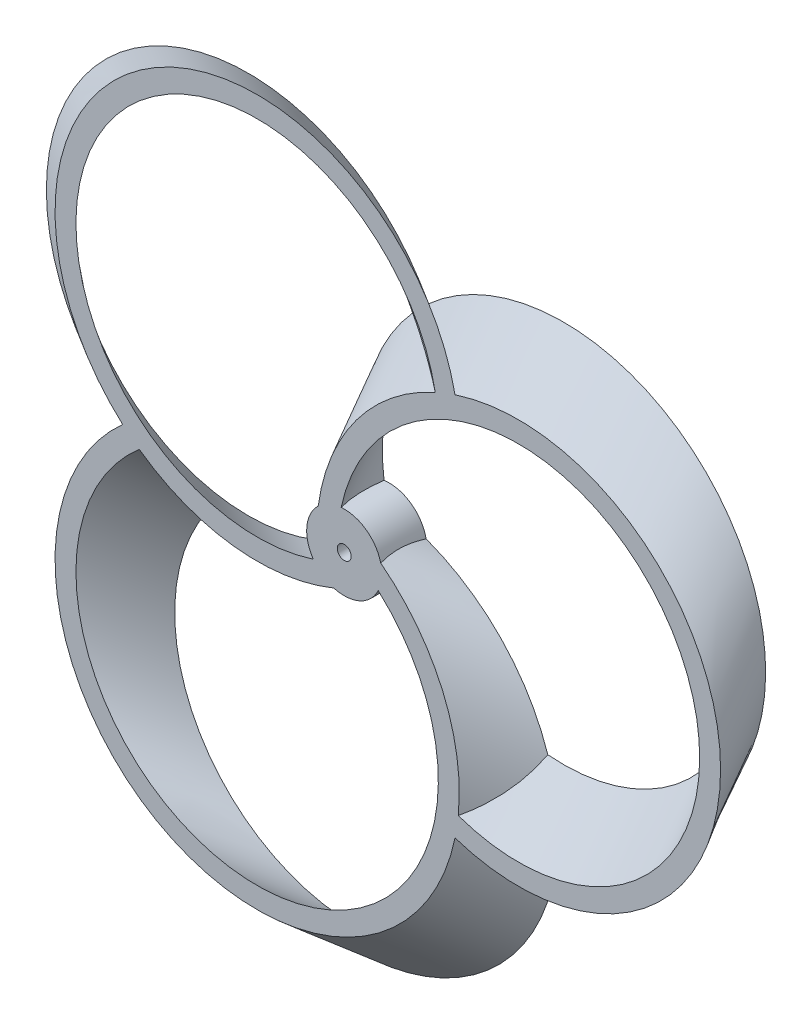
ISO-10303-21;
HEADER;
FILE_DESCRIPTION(('STEP AP214'),'2;1');
FILE_NAME('part.step','',(''),(''),'','','');
FILE_SCHEMA(('AUTOMOTIVE_DESIGN { 1 0 10303 214 1 1 1 1 }'));
ENDSEC;
DATA;
#1=APPLICATION_CONTEXT('core data for automotive mechanical design processes');
#2=APPLICATION_PROTOCOL_DEFINITION('international standard','automotive_design',2000,#1);
#3=PRODUCT_CONTEXT('',#1,'mechanical');
#4=PRODUCT('Part','Part','',(#3));
#5=PRODUCT_RELATED_PRODUCT_CATEGORY('part','',(#4));
#6=PRODUCT_DEFINITION_FORMATION('','',#4);
#7=PRODUCT_DEFINITION_CONTEXT('part definition',#1,'design');
#8=PRODUCT_DEFINITION('design','',#6,#7);
#9=PRODUCT_DEFINITION_SHAPE('','',#8);
#10=(LENGTH_UNIT() NAMED_UNIT(*) SI_UNIT(.MILLI.,.METRE.));
#11=(NAMED_UNIT(*) PLANE_ANGLE_UNIT() SI_UNIT($,.RADIAN.));
#12=(NAMED_UNIT(*) SI_UNIT($,.STERADIAN.) SOLID_ANGLE_UNIT());
#13=UNCERTAINTY_MEASURE_WITH_UNIT(LENGTH_MEASURE(1.E-05),#10,'distance_accuracy_value','');
#14=(GEOMETRIC_REPRESENTATION_CONTEXT(3) GLOBAL_UNCERTAINTY_ASSIGNED_CONTEXT((#13)) GLOBAL_UNIT_ASSIGNED_CONTEXT((#10,
#11,#12)) REPRESENTATION_CONTEXT('',''));
#15=CARTESIAN_POINT('',(0.,0.,0.));
#16=DIRECTION('',(0.,0.,1.));
#17=DIRECTION('',(1.,0.,0.));
#18=AXIS2_PLACEMENT_3D('',#15,#16,#17);
#19=CARTESIAN_POINT('',(0.,4.44959346906221,-3.23281888760861));
#20=DIRECTION('',(0.,0.,1.));
#21=DIRECTION('',(1.,0.,0.));
#22=AXIS2_PLACEMENT_3D('',#19,#20,#21);
#23=CIRCLE('',#22,13.);
#24=DIRECTION('',(0.,-0.809016994374947,0.587785252292474));
#25=VECTOR('',#24,1.);
#26=SURFACE_OF_LINEAR_EXTRUSION('',#23,#25);
#27=CARTESIAN_POINT('',(0.,0.,0.));
#28=DIRECTION('',(0.,0.,1.));
#29=DIRECTION('',(1.,0.,0.));
#30=AXIS2_PLACEMENT_3D('',#27,#28,#29);
#31=CIRCLE('',#30,13.);
#32=CARTESIAN_POINT('',(-4.32122949310312,-12.2607901730653,0.));
#33=VERTEX_POINT('',#32);
#34=CARTESIAN_POINT('',(-12.7189837148581,2.68839231905867,0.));
#35=VERTEX_POINT('',#34);
#36=EDGE_CURVE('E60',#33,#35,#31,.T.);
#37=ORIENTED_EDGE('',*,*,#36,.T.);
#38=CARTESIAN_POINT('',(-12.7189837148581,2.68839231905867,0.));
#39=CARTESIAN_POINT('',(-12.7463417927234,2.68615857240916,-0.0923844254176689));
#40=CARTESIAN_POINT('',(-12.7718338753196,2.6836667689847,-0.185319150187502));
#41=CARTESIAN_POINT('',(-12.8189369738117,2.67848003238839,-0.372170355485341));
#42=CARTESIAN_POINT('',(-12.8405476095616,2.67578507935687,-0.466086931222962));
#43=CARTESIAN_POINT('',(-12.8797372619475,2.67050505660484,-0.654783825309206));
#44=CARTESIAN_POINT('',(-12.8973154671817,2.66792000908452,-0.749564313511201));
#45=CARTESIAN_POINT('',(-12.9283501862398,2.66311223085249,-0.939796469361922));
#46=CARTESIAN_POINT('',(-12.9418069031029,2.66088948229516,-1.03524810371053));
#47=CARTESIAN_POINT('',(-12.9754810234457,2.65515803792089,-1.31862116087548));
#48=CARTESIAN_POINT('',(-12.989776671156,2.65246492852231,-1.50729629798837));
#49=CARTESIAN_POINT('',(-13.0025089545335,2.65008141766242,-1.88509885026276));
#50=CARTESIAN_POINT('',(-13.0009531788899,2.65038957937349,-2.07422600567292));
#51=CARTESIAN_POINT('',(-12.9878245433991,2.65281734198664,-2.34394061224457));
#52=CARTESIAN_POINT('',(-12.9824737432342,2.65380304428468,-2.42488601986645));
#53=CARTESIAN_POINT('',(-12.9690101636256,2.65621643668724,-2.58652999720265));
#54=CARTESIAN_POINT('',(-12.9608978873113,2.65764404627382,-2.66722860918161));
#55=CARTESIAN_POINT('',(-12.9418775326857,2.66087314117271,-2.8289914686251));
#56=CARTESIAN_POINT('',(-12.9309459688331,2.6626777417046,-2.91005287604245));
#57=CARTESIAN_POINT('',(-12.9063619642531,2.6665383299205,-3.07176661633674));
#58=CARTESIAN_POINT('',(-12.892709183851,2.66859434897533,-3.15241889685446));
#59=CARTESIAN_POINT('',(-12.8777173239326,2.67071839619004,-3.23281888760861));
#60=B_SPLINE_CURVE_WITH_KNOTS('',3,(#38,#39,#40,#41,#42,#43,#44,#45,#46,#47,#48,#49,#50,#51,#52,
#53,#54,#55,#56,#57,#58,#59),.UNSPECIFIED.,.F.,.F.,(4,2,2,2,2,2,2,2,2,2,4),(0.,
0.289113642145493,0.578255584451217,0.867455656690222,1.15664147960659,1.72360184655008,
2.29029080040493,2.5336378390645,2.77694056462379,3.02233950676622,3.26776909994948),.UNSPECIFIED.);
#61=CARTESIAN_POINT('',(-12.8777173239326,2.67071839619005,-3.23281888760861));
#62=VERTEX_POINT('',#61);
#63=EDGE_CURVE('E146',#35,#62,#60,.T.);
#64=ORIENTED_EDGE('',*,*,#63,.T.);
#65=CARTESIAN_POINT('',(0.,4.44959346906221,-3.23281888760861));
#66=DIRECTION('',(0.,0.,1.));
#67=DIRECTION('',(1.,0.,0.));
#68=AXIS2_PLACEMENT_3D('',#65,#66,#67);
#69=CIRCLE('',#68,13.);
#70=CARTESIAN_POINT('',(-1.12851168990511,-8.50133164715044,-3.23281888760861));
#71=VERTEX_POINT('',#70);
#72=EDGE_CURVE('E336',#71,#62,#69,.T.);
#73=ORIENTED_EDGE('',*,*,#72,.F.);
#74=CARTESIAN_POINT('',(-1.12851168990511,-8.50133164715044,-3.23281888760861));
#75=CARTESIAN_POINT('',(-1.18645766435644,-8.64814617753544,-3.12248080137753));
#76=CARTESIAN_POINT('',(-1.2502988430566,-8.79309059835952,-3.01284916794036));
#77=CARTESIAN_POINT('',(-1.38863222664076,-9.07864108878982,-2.79513133820698));
#78=CARTESIAN_POINT('',(-1.46310920004046,-9.21925301872113,-2.68704317092416));
#79=CARTESIAN_POINT('',(-1.62172037115464,-9.49591595256459,-2.47226542708657));
#80=CARTESIAN_POINT('',(-1.70585155738023,-9.63196836173428,-2.36557542590255));
#81=CARTESIAN_POINT('',(-1.88140983565848,-9.89695099901534,-2.15527844702374));
#82=CARTESIAN_POINT('',(-1.97268786506394,-10.0259631608396,-2.0516499303572));
#83=CARTESIAN_POINT('',(-2.16305305928808,-10.27907142084,-1.84547197766964));
#84=CARTESIAN_POINT('',(-2.26214242611901,-10.4031661178638,-1.74292285523076));
#85=CARTESIAN_POINT('',(-2.46744051634613,-10.6461193864864,-1.53881419645728));
#86=CARTESIAN_POINT('',(-2.57364910448283,-10.7649780574944,-1.43725464136365));
#87=CARTESIAN_POINT('',(-2.9256944925095,-11.1383747988034,-1.11201126192171));
#88=CARTESIAN_POINT('',(-3.18442411758121,-11.3823429845432,-0.889837189466662));
#89=CARTESIAN_POINT('',(-3.5481263079914,-11.6887739345416,-0.594326102541099));
#90=CARTESIAN_POINT('',(-3.64144886969094,-11.7644378617914,-0.519864259704357));
#91=CARTESIAN_POINT('',(-3.83096536276109,-11.9123110447375,-0.371112065703074));
#92=CARTESIAN_POINT('',(-3.92715953912305,-11.9845200042981,-0.296821729756467));
#93=CARTESIAN_POINT('',(-4.12223194822886,-12.1253663210096,-0.148345895362834));
#94=CARTESIAN_POINT('',(-4.2211105112913,-12.1940032355551,-0.0741604110104488));
#95=CARTESIAN_POINT('',(-4.32122949310312,-12.2607901730653,0.));
#96=B_SPLINE_CURVE_WITH_KNOTS('',3,(#74,#75,#76,#77,#78,#79,#80,#81,#82,#83,#84,#85,#86,#87,#88,
#89,#90,#91,#92,#93,#94,#95),.UNSPECIFIED.,.F.,.F.,(4,2,2,2,2,2,2,2,2,2,4),(0.,
0.577554499969389,1.15429002967393,1.73084614181192,2.29756004548099,2.86443428077121,
3.43129774895683,4.68674562692945,5.11075151890951,5.53479368885221,5.95888827658714),.UNSPECIFIED.);
#97=EDGE_CURVE('E292',#71,#33,#96,.T.);
#98=ORIENTED_EDGE('',*,*,#97,.T.);
#99=EDGE_LOOP('',(#37,#64,#73,#98));
#100=FACE_BOUND('',#99,.T.);
#101=ADVANCED_FACE('F43',(#100),#26,.F.);
#102=CARTESIAN_POINT('',(0.,4.44959346906221,-3.23281888760861));
#103=DIRECTION('',(0.,0.,1.));
#104=DIRECTION('',(1.,0.,0.));
#105=AXIS2_PLACEMENT_3D('',#102,#103,#104);
#106=CIRCLE('',#105,14.5);
#107=DIRECTION('',(0.,-0.809016994374947,0.587785252292474));
#108=VECTOR('',#107,1.);
#109=SURFACE_OF_LINEAR_EXTRUSION('',#106,#108);
#110=CARTESIAN_POINT('',(-14.3689837148581,1.94481541595645,0.));
#111=CARTESIAN_POINT('',(-14.3847538150584,1.9296508825989,-0.0735960266043187));
#112=CARTESIAN_POINT('',(-14.3990224233594,1.91557833195695,-0.147742582054409));
#113=CARTESIAN_POINT('',(-14.424611939459,1.88987154416126,-0.296903709137461));
#114=CARTESIAN_POINT('',(-14.435934979277,1.87823554461434,-0.371917611673274));
#115=CARTESIAN_POINT('',(-14.4557084516388,1.85763649842712,-0.522665684282725));
#116=CARTESIAN_POINT('',(-14.4641597239589,1.8486726704715,-0.598399637124876));
#117=CARTESIAN_POINT('',(-14.47819201337,1.83364878587357,-0.749102996324598));
#118=CARTESIAN_POINT('',(-14.4838194810869,1.82754185634638,-0.824063443556932));
#119=CARTESIAN_POINT('',(-14.4925566153714,1.81801182638733,-0.974305483436748));
#120=CARTESIAN_POINT('',(-14.4956660712707,1.81458895051635,-1.04958710242534));
#121=CARTESIAN_POINT('',(-14.4995221530891,1.8103385751389,-1.20027272057413));
#122=CARTESIAN_POINT('',(-14.5002689788354,1.8095108561384,-1.27567670884478));
#123=CARTESIAN_POINT('',(-14.4994229721008,1.81044692236285,-1.45580166263563));
#124=CARTESIAN_POINT('',(-14.4968066434841,1.81334445132072,-1.56051312046061));
#125=CARTESIAN_POINT('',(-14.4877305874762,1.82328744738253,-1.76961079201857));
#126=CARTESIAN_POINT('',(-14.4812688071757,1.83033513004109,-1.87399680206638));
#127=CARTESIAN_POINT('',(-14.4648453495149,1.84795408852355,-2.08227568116927));
#128=CARTESIAN_POINT('',(-14.4548806821437,1.85852837420535,-2.18616805183284));
#129=CARTESIAN_POINT('',(-14.4314432503005,1.88287710508057,-2.39585602025606));
#130=CARTESIAN_POINT('',(-14.4178884827088,1.89672541445419,-2.50163368436388));
#131=CARTESIAN_POINT('',(-14.3876462191943,1.92682452622314,-2.71227919806507));
#132=CARTESIAN_POINT('',(-14.3709618387034,1.94307293600404,-2.81714784486745));
#133=CARTESIAN_POINT('',(-14.3346540800261,1.97739121623045,-3.02575631359646));
#134=CARTESIAN_POINT('',(-14.3150393545125,1.99545567456572,-3.12949852532752));
#135=CARTESIAN_POINT('',(-14.2940117158057,2.0141819908088,-3.23281888760861));
#136=B_SPLINE_CURVE_WITH_KNOTS('',3,(#110,#111,#112,#113,#114,#115,#116,#117,#118,#119,#120,
#121,#122,#123,#124,#125,#126,#127,#128,#129,#130,#131,#132,#133,#134,#135),.UNSPECIFIED.,.F.,
.F.,(4,2,2,2,2,2,2,2,2,2,2,2,4),(0.,0.230318749066538,0.460470325310438,0.690554541461471,
0.916718532286049,1.14290144306306,1.36906522315318,1.68323448620635,1.99757162039073,
2.31217772209166,2.63470426140724,2.95691142331416,3.27818532396254),.UNSPECIFIED.);
#137=CARTESIAN_POINT('',(-14.3689837148581,1.94481541595644,0.));
#138=VERTEX_POINT('',#137);
#139=CARTESIAN_POINT('',(-14.2940117158057,2.01418199080879,-3.23281888760861));
#140=VERTEX_POINT('',#139);
#141=EDGE_CURVE('E134',#138,#140,#136,.T.);
#142=ORIENTED_EDGE('',*,*,#141,.F.);
#143=CARTESIAN_POINT('',(0.,0.,0.));
#144=DIRECTION('',(0.,0.,1.));
#145=DIRECTION('',(1.,0.,0.));
#146=AXIS2_PLACEMENT_3D('',#143,#144,#145);
#147=CIRCLE('',#146,14.5);
#148=CARTESIAN_POINT('',(-5.97122949310328,13.2134181172282,0.));
#149=VERTEX_POINT('',#148);
#150=EDGE_CURVE('E166',#149,#138,#147,.T.);
#151=ORIENTED_EDGE('',*,*,#150,.F.);
#152=CARTESIAN_POINT('',(-10.8233749826185,14.098663578955,-3.23281888760861));
#153=CARTESIAN_POINT('',(-10.6672568824348,14.1218881582256,-3.12248080137753));
#154=CARTESIAN_POINT('',(-10.5098107425142,14.1390722860758,-3.01284916794036));
#155=CARTESIAN_POINT('',(-10.1933500719464,14.1620473069156,-2.79513133820698));
#156=CARTESIAN_POINT('',(-10.0343380818509,14.1678543209201,-2.68704317092417));
#157=CARTESIAN_POINT('',(-9.71543536729986,14.168824484333,-2.47226542708658));
#158=CARTESIAN_POINT('',(-9.55554493160004,14.163990944396,-2.36557542590256));
#159=CARTESIAN_POINT('',(-9.23828409701373,14.1444443342029,-2.15527844702375));
#160=CARTESIAN_POINT('',(-9.080917272774,14.1299013228425,-2.05164993035721));
#161=CARTESIAN_POINT('',(-8.76653649259394,14.0915943586482,-1.84547197766966));
#162=CARTESIAN_POINT('',(-8.60952264908093,14.0678277982396,-1.74292285523078));
#163=CARTESIAN_POINT('',(-8.29646990140777,14.0115110710658,-1.5388141964573));
#164=CARTESIAN_POINT('',(-8.14043097878644,13.9789610711433,-1.43725464136368));
#165=CARTESIAN_POINT('',(-7.64103722110913,13.8607791924816,-1.11201126192173));
#166=CARTESIAN_POINT('',(-7.30038976200746,13.7586968573278,-0.889837189466679));
#167=CARTESIAN_POINT('',(-6.85316167959791,13.5969369960197,-0.59432610254111));
#168=CARTESIAN_POINT('',(-6.74097351559971,13.5539492504666,-0.519864259704367));
#169=CARTESIAN_POINT('',(-6.51815333609484,13.4637597445048,-0.37111206570308));
#170=CARTESIAN_POINT('',(-6.40752145455357,13.4165576238595,-0.29682172975647));
#171=CARTESIAN_POINT('',(-6.18800876169901,13.3180431203522,-0.148345895362833));
#172=CARTESIAN_POINT('',(-6.07912816853404,13.2667302301231,-0.0741604110104469));
#173=CARTESIAN_POINT('',(-5.97122949310327,13.2134181172282,0.));
#174=B_SPLINE_CURVE_WITH_KNOTS('',3,(#152,#153,#154,#155,#156,#157,#158,#159,#160,#161,#162,
#163,#164,#165,#166,#167,#168,#169,#170,#171,#172,#173),.UNSPECIFIED.,.F.,.F.,(4,2,2,2,2,2,2,2,
2,2,4),(0.,0.577554499969378,1.1542900296739,1.73084614181189,2.29756004548094,2.86443428077115,
3.43129774895676,4.6867456269294,5.11075151890947,5.53479368885217,5.95888827658711),.UNSPECIFIED.);
#175=CARTESIAN_POINT('',(-10.8233749826186,14.098663578955,-3.23281888760861));
#176=VERTEX_POINT('',#175);
#177=EDGE_CURVE('E164',#176,#149,#174,.T.);
#178=ORIENTED_EDGE('',*,*,#177,.F.);
#179=EDGE_CURVE('E154',#176,#140,#106,.T.);
#180=ORIENTED_EDGE('',*,*,#179,.T.);
#181=EDGE_LOOP('',(#142,#151,#178,#180));
#182=FACE_BOUND('',#181,.T.);
#183=ADVANCED_FACE('F162',(#182),#109,.T.);
#184=CARTESIAN_POINT('',(-22.6034609807212,8.60052081277433,-3.23281888760861));
#185=DIRECTION('',(0.,0.,1.));
#186=DIRECTION('',(-0.500000000000004,0.866025403784436,0.));
#187=AXIS2_PLACEMENT_3D('',#184,#185,#186);
#188=CIRCLE('',#187,14.5);
#189=DIRECTION('',(0.700629269222034,0.404508497187477,0.587785252292474));
#190=VECTOR('',#189,1.);
#191=SURFACE_OF_LINEAR_EXTRUSION('',#188,#190);
#192=CARTESIAN_POINT('',(-13.2497676984608,-2.59099508430477,0.));
#193=CARTESIAN_POINT('',(-13.2287497772365,-2.59707012501966,-0.0735960266043842));
#194=CARTESIAN_POINT('',(-13.209428286734,-2.60239082696402,-0.147742582054474));
#195=CARTESIAN_POINT('',(-13.1743707974035,-2.61169860407894,-0.296903709137526));
#196=CARTESIAN_POINT('',(-13.1586322062884,-2.61568664443597,-0.371917611673338));
#197=CARTESIAN_POINT('',(-13.1309061728157,-2.62251145072866,-0.522665684282789));
#198=CARTESIAN_POINT('',(-13.1189176339309,-2.62534855327435,-0.598399637124942));
#199=CARTESIAN_POINT('',(-13.0988904235,-2.62998893007867,-0.749102996324665));
#200=CARTESIAN_POINT('',(-13.0907879335319,-2.63180899531688,-0.824063443556999));
#201=CARTESIAN_POINT('',(-13.0781661183463,-2.63461056058403,-0.974305483436814));
#202=CARTESIAN_POINT('',(-13.0736470929383,-2.63559199044931,-1.04958710242541));
#203=CARTESIAN_POINT('',(-13.0680381189767,-2.63680626757434,-1.2002727205742));
#204=CARTESIAN_POINT('',(-13.0669478804219,-2.63703917814263,-1.27567670884485));
#205=CARTESIAN_POINT('',(-13.0681815409192,-2.63677454793091,-1.45580166263569));
#206=CARTESIAN_POINT('',(-13.0719990389133,-2.6359575053631,-1.56051312046067));
#207=CARTESIAN_POINT('',(-13.0851479540965,-2.633068908325,-1.76961079201863));
#208=CARTESIAN_POINT('',(-13.0944823164668,-2.63099668376037,-1.87399680206642));
#209=CARTESIAN_POINT('',(-13.1179525109313,-2.62558303144939,-2.08227568116931));
#210=CARTESIAN_POINT('',(-13.1320924446442,-2.62224051920656,-2.18616805183288));
#211=CARTESIAN_POINT('',(-13.1648977800536,-2.61411747326855,-2.39585602025609));
#212=CARTESIAN_POINT('',(-13.1836681515665,-2.60930285487855,-2.50163368436391));
#213=CARTESIAN_POINT('',(-13.224855878747,-2.59816184229151,-2.71227919806509));
#214=CARTESIAN_POINT('',(-13.2472696046338,-2.59183694983045,-2.81714784486746));
#215=CARTESIAN_POINT('',(-13.2951439864627,-2.57755264857457,-3.02575631359647));
#216=CARTESIAN_POINT('',(-13.3205956290435,-2.56959802715921,-3.12949852532752));
#217=CARTESIAN_POINT('',(-13.3473269139827,-2.56075071597907,-3.23281888760861));
#218=B_SPLINE_CURVE_WITH_KNOTS('',3,(#192,#193,#194,#195,#196,#197,#198,#199,#200,#201,#202,
#203,#204,#205,#206,#207,#208,#209,#210,#211,#212,#213,#214,#215,#216,#217),.UNSPECIFIED.,.F.,
.F.,(4,2,2,2,2,2,2,2,2,2,2,2,4),(0.,0.230318749066539,0.460470325310438,0.690554541461471,
0.91671853228605,1.14290144306306,1.36906522315318,1.68323448620634,1.99757162039071,
2.31217772209163,2.6347042614072,2.9569114233141,3.27818532396247),.UNSPECIFIED.);
#219=CARTESIAN_POINT('',(-13.2497676984608,-2.59099508430477,0.));
#220=VERTEX_POINT('',#219);
#221=CARTESIAN_POINT('',(-13.3473269139827,-2.56075071597907,-3.23281888760861));
#222=VERTEX_POINT('',#221);
#223=EDGE_CURVE('E147',#220,#222,#218,.T.);
#224=ORIENTED_EDGE('',*,*,#223,.F.);
#225=CARTESIAN_POINT('',(-18.75,10.8253175473055,0.));
#226=DIRECTION('',(0.,0.,1.));
#227=DIRECTION('',(-0.500000000000004,0.866025403784436,0.));
#228=AXIS2_PLACEMENT_3D('',#225,#226,#227);
#229=CIRCLE('',#228,14.5);
#230=CARTESIAN_POINT('',(-27.2075410137935,-0.952627944162983,0.));
#231=VERTEX_POINT('',#230);
#232=EDGE_CURVE('E167',#231,#220,#229,.T.);
#233=ORIENTED_EDGE('',*,*,#232,.F.);
#234=CARTESIAN_POINT('',(-27.2075410137935,-0.952627944162982,0.));
#235=CARTESIAN_POINT('',(-27.1974852453511,-1.10781024172505,-0.0958240883057379));
#236=CARTESIAN_POINT('',(-27.1837275633948,-1.26271140105515,-0.19167031526418));
#237=CARTESIAN_POINT('',(-27.1488051648338,-1.57155256864467,-0.383598692563256));
#238=CARTESIAN_POINT('',(-27.1276396422702,-1.72549247046546,-0.479680867444646));
#239=CARTESIAN_POINT('',(-27.0529647914315,-2.18562912716629,-0.768793887481483));
#240=CARTESIAN_POINT('',(-26.9883039156924,-2.4897274792722,-0.962437086172746));
#241=CARTESIAN_POINT('',(-26.8413555498713,-3.04208792041832,-1.32239305891755));
#242=CARTESIAN_POINT('',(-26.7633137327912,-3.29173913703731,-1.48832427503447));
#243=CARTESIAN_POINT('',(-26.5856175276696,-3.78116596917834,-1.82266202992291));
#244=CARTESIAN_POINT('',(-26.4859848437783,-4.02095121648104,-1.99106592569477));
#245=CARTESIAN_POINT('',(-26.2614567281139,-4.49434784275585,-2.33588875131675));
#246=CARTESIAN_POINT('',(-26.1359317119411,-4.72759802360199,-2.5124000489996));
#247=CARTESIAN_POINT('',(-25.929479494772,-5.06437588988879,-2.78014056959159));
#248=CARTESIAN_POINT('',(-25.8575406639586,-5.17457240043318,-2.86998889752848));
#249=CARTESIAN_POINT('',(-25.70748660592,-5.38990993179006,-3.05066780601269));
#250=CARTESIAN_POINT('',(-25.6293693259867,-5.495049253603,-3.14149870428073));
#251=CARTESIAN_POINT('',(-25.5481133274762,-5.59733193180471,-3.23281888760861));
#252=B_SPLINE_CURVE_WITH_KNOTS('',3,(#234,#235,#236,#237,#238,#239,#240,#241,#242,#243,#244,
#245,#246,#247,#248,#249,#250,#251),.UNSPECIFIED.,.F.,.F.,(4,2,2,2,2,2,2,2,4),(0.,
0.547896267708718,1.09585216402203,2.19322259724976,3.12166589121922,4.04918016451897,
5.00268083594295,5.48054042070355,5.95855944034039),.UNSPECIFIED.);
#253=CARTESIAN_POINT('',(-25.5481133274762,-5.59733193180471,-3.23281888760861));
#254=VERTEX_POINT('',#253);
#255=EDGE_CURVE('E267',#231,#254,#252,.T.);
#256=ORIENTED_EDGE('',*,*,#255,.T.);
#257=EDGE_CURVE('E173',#254,#222,#188,.T.);
#258=ORIENTED_EDGE('',*,*,#257,.T.);
#259=EDGE_LOOP('',(#224,#233,#256,#258));
#260=FACE_BOUND('',#259,.T.);
#261=ADVANCED_FACE('F183',(#260),#191,.T.);
#262=CARTESIAN_POINT('',(-14.8965390192787,-13.0501142818366,-3.23281888760861));
#263=DIRECTION('',(0.,0.,1.));
#264=DIRECTION('',(-0.499999999999992,-0.866025403784443,0.));
#265=AXIS2_PLACEMENT_3D('',#262,#263,#264);
#266=CIRCLE('',#265,14.5);
#267=DIRECTION('',(-0.70062926922204,0.404508497187467,0.587785252292474));
#268=VECTOR('',#267,1.);
#269=SURFACE_OF_LINEAR_EXTRUSION('',#266,#268);
#270=CARTESIAN_POINT('',(-9.88124858668107,0.646179668348361,0.));
#271=CARTESIAN_POINT('',(-9.8864964077051,0.667419242420791,-0.0735960266043861));
#272=CARTESIAN_POINT('',(-9.89154928990656,0.686812495007096,-0.147742582054476));
#273=CARTESIAN_POINT('',(-9.90101726313755,0.721827059917702,-0.296903709137529));
#274=CARTESIAN_POINT('',(-9.90543281443458,0.737451099821654,-0.371917611673342));
#275=CARTESIAN_POINT('',(-9.91338537554557,0.764874952301562,-0.522665684282794));
#276=CARTESIAN_POINT('',(-9.91692264211025,0.776675882802877,-0.598399637124945));
#277=CARTESIAN_POINT('',(-9.92291756313002,0.796340144205123,-0.749102996324668));
#278=CARTESIAN_POINT('',(-9.92539258538124,0.804267138970526,-0.824063443557002));
#279=CARTESIAN_POINT('',(-9.92927726628234,0.816598734196726,-0.974305483436818));
#280=CARTESIAN_POINT('',(-9.93068683579094,0.821003039932978,-1.04958710242541));
#281=CARTESIAN_POINT('',(-9.93243972793427,0.826467692435458,-1.2002727205742));
#282=CARTESIAN_POINT('',(-9.93278314074271,0.827528322004244,-1.27567670884485));
#283=CARTESIAN_POINT('',(-9.93239548698002,0.826327625568082,-1.45580166263569));
#284=CARTESIAN_POINT('',(-9.93119431760267,0.822613054042397,-1.56051312046067));
#285=CARTESIAN_POINT('',(-9.92712145842736,0.809781460942482,-1.76961079201863));
#286=CARTESIAN_POINT('',(-9.92424887635749,0.800661553719294,-1.87399680206643));
#287=CARTESIAN_POINT('',(-9.91720213955384,0.777628942925852,-2.08227568116931));
#288=CARTESIAN_POINT('',(-9.91302687321214,0.763712145001233,-2.18616805183288));
#289=CARTESIAN_POINT('',(-9.90365896964585,0.73124036818799,-2.39585602025609));
#290=CARTESIAN_POINT('',(-9.89844336572468,0.712577440424375,-2.50163368436391));
#291=CARTESIAN_POINT('',(-9.88749790205869,0.671337316068395,-2.71227919806509));
#292=CARTESIAN_POINT('',(-9.88176855666277,0.648764013826422,-2.81714784486746));
#293=CARTESIAN_POINT('',(-9.8702019335112,0.600161432344137,-3.02575631359647));
#294=CARTESIAN_POINT('',(-9.86436501644402,0.574142352593513,-3.12949852532752));
#295=CARTESIAN_POINT('',(-9.85866137021161,0.5465687251703,-3.23281888760861));
#296=B_SPLINE_CURVE_WITH_KNOTS('',3,(#270,#271,#272,#273,#274,#275,#276,#277,#278,#279,#280,
#281,#282,#283,#284,#285,#286,#287,#288,#289,#290,#291,#292,#293,#294,#295),.UNSPECIFIED.,.F.,
.F.,(4,2,2,2,2,2,2,2,2,2,2,2,4),(0.,0.230318749066538,0.460470325310437,0.690554541461471,
0.916718532286049,1.14290144306306,1.36906522315318,1.68323448620634,1.99757162039071,
2.31217772209163,2.63470426140719,2.9569114233141,3.27818532396246),.UNSPECIFIED.);
#297=CARTESIAN_POINT('',(-9.88124858668106,0.646179668348356,0.));
#298=VERTEX_POINT('',#297);
#299=CARTESIAN_POINT('',(-9.85866137021161,0.546568725170302,-3.23281888760861));
#300=VERTEX_POINT('',#299);
#301=EDGE_CURVE('E68',#298,#300,#296,.T.);
#302=ORIENTED_EDGE('',*,*,#301,.F.);
#303=CARTESIAN_POINT('',(-18.7499999999999,-10.8253175473055,0.));
#304=DIRECTION('',(0.,0.,1.));
#305=DIRECTION('',(-0.499999999999992,-0.866025403784443,0.));
#306=AXIS2_PLACEMENT_3D('',#303,#304,#305);
#307=CIRCLE('',#306,14.5);
#308=EDGE_CURVE('E255',#33,#298,#307,.T.);
#309=ORIENTED_EDGE('',*,*,#308,.F.);
#310=ORIENTED_EDGE('',*,*,#97,.F.);
#311=EDGE_CURVE('E250',#71,#300,#266,.T.);
#312=ORIENTED_EDGE('',*,*,#311,.T.);
#313=EDGE_LOOP('',(#302,#309,#310,#312));
#314=FACE_BOUND('',#313,.T.);
#315=ADVANCED_FACE('F242',(#314),#269,.T.);
#316=CARTESIAN_POINT('',(-22.6034609807212,8.60052081277433,-3.23281888760861));
#317=DIRECTION('',(0.,0.,1.));
#318=DIRECTION('',(-0.500000000000004,0.866025403784436,0.));
#319=AXIS2_PLACEMENT_3D('',#316,#317,#318);
#320=CIRCLE('',#319,13.);
#321=DIRECTION('',(0.700629269222034,0.404508497187477,0.587785252292474));
#322=VECTOR('',#321,1.);
#323=SURFACE_OF_LINEAR_EXTRUSION('',#320,#322);
#324=CARTESIAN_POINT('',(-18.75,10.8253175473055,0.));
#325=DIRECTION('',(0.,0.,1.));
#326=DIRECTION('',(-0.500000000000004,0.866025403784436,0.));
#327=AXIS2_PLACEMENT_3D('',#324,#325,#326);
#328=CIRCLE('',#327,13.);
#329=CARTESIAN_POINT('',(-14.7187241862147,-1.53384161961157,0.));
#330=VERTEX_POINT('',#329);
#331=EDGE_CURVE('E256',#149,#330,#328,.T.);
#332=ORIENTED_EDGE('',*,*,#331,.T.);
#333=CARTESIAN_POINT('',(-14.7187241862147,-1.53384161961157,0.));
#334=CARTESIAN_POINT('',(-14.703110665938,-1.55641753671685,-0.0923844254176677));
#335=CARTESIAN_POINT('',(-14.6882066595731,-1.57724842612827,-0.185319150187501));
#336=CARTESIAN_POINT('',(-14.6601632646719,-1.61544753772126,-0.37217035548534));
#337=CARTESIAN_POINT('',(-14.6470240490096,-1.63281542075681,-0.466086931222961));
#338=CARTESIAN_POINT('',(-14.6228565889808,-1.66411464391249,-0.654783825309204));
#339=CARTESIAN_POINT('',(-14.6118287695412,-1.67804529243809,-0.749564313511199));
#340=CARTESIAN_POINT('',(-14.5921477519274,-1.70251825842568,-0.939796469361921));
#341=CARTESIAN_POINT('',(-14.583494436779,-1.71306074280201,-1.03524810371053));
#342=CARTESIAN_POINT('',(-14.5616938001791,-1.73935766428184,-1.31862116087547));
#343=CARTESIAN_POINT('',(-14.5522136751696,-1.75039150366323,-1.50729629798837));
#344=CARTESIAN_POINT('',(-14.543783352526,-1.76022622908639,-1.88509885026276));
#345=CARTESIAN_POINT('',(-14.544828116218,-1.75903296871196,-2.07422600567292));
#346=CARTESIAN_POINT('',(-14.5534949380608,-1.74887711816646,-2.34394061224457));
#347=CARTESIAN_POINT('',(-14.5570239813739,-1.74473604044213,-2.42488601986645));
#348=CARTESIAN_POINT('',(-14.5658458303081,-1.73428293467652,-2.58652999720265));
#349=CARTESIAN_POINT('',(-14.5711383146339,-1.72797130209908,-2.66722860918161));
#350=CARTESIAN_POINT('',(-14.5834449701604,-1.71311373925379,-2.8289914686251));
#351=CARTESIAN_POINT('',(-14.590473581991,-1.70454902752024,-2.91005287604245));
#352=CARTESIAN_POINT('',(-14.6061089517495,-1.68518894913521,-3.07176661633674));
#353=CARTESIAN_POINT('',(-14.6147159066827,-1.67439330400207,-3.15241889685446));
#354=CARTESIAN_POINT('',(-14.6240513154887,-1.66247199607015,-3.23281888760861));
#355=B_SPLINE_CURVE_WITH_KNOTS('',3,(#333,#334,#335,#336,#337,#338,#339,#340,#341,#342,#343,
#344,#345,#346,#347,#348,#349,#350,#351,#352,#353,#354),.UNSPECIFIED.,.F.,.F.,(4,2,2,2,2,2,2,2,
2,2,4),(0.,0.289113642145493,0.578255584451217,0.867455656690222,1.15664147960659,
1.72360184655008,2.29029080040493,2.5336378390645,2.77694056462379,3.02233950676622,
3.26776909994948),.UNSPECIFIED.);
#356=CARTESIAN_POINT('',(-14.6240513154887,-1.66247199607015,-3.23281888760861));
#357=VERTEX_POINT('',#356);
#358=EDGE_CURVE('E230',#330,#357,#355,.T.);
#359=ORIENTED_EDGE('',*,*,#358,.T.);
#360=EDGE_CURVE('E155',#176,#357,#320,.T.);
#361=ORIENTED_EDGE('',*,*,#360,.F.);
#362=ORIENTED_EDGE('',*,*,#177,.T.);
#363=EDGE_LOOP('',(#332,#359,#361,#362));
#364=FACE_BOUND('',#363,.T.);
#365=ADVANCED_FACE('F247',(#364),#323,.F.);
#366=CARTESIAN_POINT('',(-22.6034609807212,8.60052081277433,-3.23281888760861));
#367=DIRECTION('',(0.,0.,1.));
#368=DIRECTION('',(-0.500000000000004,0.866025403784436,0.));
#369=AXIS2_PLACEMENT_3D('',#366,#367,#368);
#370=CIRCLE('',#369,14.5);
#371=DIRECTION('',(0.700629269222034,0.404508497187477,0.587785252292474));
#372=VECTOR('',#371,1.);
#373=SURFACE_OF_LINEAR_EXTRUSION('',#370,#372);
#374=CARTESIAN_POINT('',(-28.3968906907873,-1.13190706807487E-13,0.));
#375=CARTESIAN_POINT('',(-28.3968854743357,-0.182963552221061,-0.10452609577167));
#376=CARTESIAN_POINT('',(-28.3925597847088,-0.365897279703365,-0.209034441597905));
#377=CARTESIAN_POINT('',(-28.3752384272529,-0.7312664735775,-0.418280144104644));
#378=CARTESIAN_POINT('',(-28.3622411750265,-0.913701842795839,-0.523017539148832));
#379=CARTESIAN_POINT('',(-28.3105498200428,-1.45584206922212,-0.835801505602992));
#380=CARTESIAN_POINT('',(-28.2591553907175,-1.81408097664252,-1.044513085254));
#381=CARTESIAN_POINT('',(-28.156173271528,-2.345217626792,-1.36017529209367));
#382=CARTESIAN_POINT('',(-28.1174711814875,-2.52142585373339,-1.46595200366845));
#383=CARTESIAN_POINT('',(-28.0313307238522,-2.87110019136782,-1.67855056583211));
#384=CARTESIAN_POINT('',(-27.9838917114824,-3.04456609865421,-1.78537249300544));
#385=CARTESIAN_POINT('',(-27.8801946007043,-3.38803787248171,-2.00022503252811));
#386=CARTESIAN_POINT('',(-27.8239379748994,-3.55804431143152,-2.10825544026013));
#387=CARTESIAN_POINT('',(-27.7015851557212,-3.89637679635539,-2.32733922452438));
#388=CARTESIAN_POINT('',(-27.6353565223411,-4.06464144068583,-2.4384136952483));
#389=CARTESIAN_POINT('',(-27.4935230480916,-4.39609369168866,-2.66224386266682));
#390=CARTESIAN_POINT('',(-27.4179164401861,-4.55928033427541,-2.77499987267185));
#391=CARTESIAN_POINT('',(-27.2570737044788,-4.87970317799646,-3.00244344884712));
#392=CARTESIAN_POINT('',(-27.1718286430821,-5.03693367538341,-3.1171327217393));
#393=CARTESIAN_POINT('',(-27.0817031701097,-5.19061209548154,-3.2328188876085));
#394=B_SPLINE_CURVE_WITH_KNOTS('',3,(#374,#375,#376,#377,#378,#379,#380,#381,#382,#383,#384,
#385,#386,#387,#388,#389,#390,#391,#392,#393),.UNSPECIFIED.,.F.,.F.,(4,2,2,2,2,2,2,2,2,4),(0.,
0.632034352423887,1.26418421666004,2.51576773141947,3.14300804800756,3.77029467277923,
4.39747664768151,5.03387473895935,5.67039292562803,6.30750599455628),.UNSPECIFIED.);
#395=CARTESIAN_POINT('',(-28.3968906907873,-1.12757025938492E-13,0.));
#396=VERTEX_POINT('',#395);
#397=CARTESIAN_POINT('',(-27.0817031701092,-5.19061209548183,-3.23281888760861));
#398=VERTEX_POINT('',#397);
#399=EDGE_CURVE('E301',#396,#398,#394,.T.);
#400=ORIENTED_EDGE('',*,*,#399,.F.);
#401=CARTESIAN_POINT('',(-18.75,10.8253175473055,0.));
#402=DIRECTION('',(0.,0.,1.));
#403=DIRECTION('',(-0.500000000000004,0.866025403784436,0.));
#404=AXIS2_PLACEMENT_3D('',#401,#402,#403);
#405=CIRCLE('',#404,14.5);
#406=CARTESIAN_POINT('',(-4.55155465460637,13.7671111794062,0.));
#407=VERTEX_POINT('',#406);
#408=EDGE_CURVE('E630',#407,#396,#405,.T.);
#409=ORIENTED_EDGE('',*,*,#408,.F.);
#410=CARTESIAN_POINT('',(-9.70435035082339,15.2234314234995,-3.23281888760861));
#411=CARTESIAN_POINT('',(-9.50788743980927,15.2247614194714,-3.10524483783067));
#412=CARTESIAN_POINT('',(-9.31066095978349,15.2188005195297,-2.9788859688168));
#413=CARTESIAN_POINT('',(-8.91590116521186,15.1931791505675,-2.72850658428633));
#414=CARTESIAN_POINT('',(-8.71836840678023,15.1735333844452,-2.60448370574013));
#415=CARTESIAN_POINT('',(-8.32382722776071,15.1214284666742,-2.35843444733282));
#416=CARTESIAN_POINT('',(-8.12681871647154,15.0889716992311,-2.23640770037771));
#417=CARTESIAN_POINT('',(-7.73722186561884,15.012560206134,-1.99596846046968));
#418=CARTESIAN_POINT('',(-7.54461274144872,14.9687943623136,-1.87752930851933));
#419=CARTESIAN_POINT('',(-7.16138272169111,14.8701241439458,-1.64202079084674));
#420=CARTESIAN_POINT('',(-6.97076214949371,14.8152179864938,-1.52495164755771));
#421=CARTESIAN_POINT('',(-6.59225440420408,14.6948058029715,-1.29195756670617));
#422=CARTESIAN_POINT('',(-6.40436675760062,14.6293016375584,-1.17603243207749));
#423=CARTESIAN_POINT('',(-5.93219185625703,14.4503621118398,-0.883173391726843));
#424=CARTESIAN_POINT('',(-5.65014378240464,14.3300398702588,-0.706801445408769));
#425=CARTESIAN_POINT('',(-5.09378037192876,14.0658588527107,-0.353607339991852));
#426=CARTESIAN_POINT('',(-4.81954797679219,13.9218141776287,-0.176793460927571));
#427=CARTESIAN_POINT('',(-4.55155465460654,13.7671111794063,-1.16226472890446E-13));
#428=B_SPLINE_CURVE_WITH_KNOTS('',3,(#410,#411,#412,#413,#414,#415,#416,#417,#418,#419,#420,
#421,#422,#423,#424,#425,#426,#427),.UNSPECIFIED.,.F.,.F.,(4,2,2,2,2,2,2,2,4),(0.,
0.702550697483441,1.40434774263898,2.10601424061331,2.79664419272403,3.48738476109419,
4.17800418975556,5.23833474893252,6.30740871250801),.UNSPECIFIED.);
#429=CARTESIAN_POINT('',(-9.70435035082339,15.2234314234995,-3.23281888760861));
#430=VERTEX_POINT('',#429);
#431=EDGE_CURVE('E296',#430,#407,#428,.T.);
#432=ORIENTED_EDGE('',*,*,#431,.F.);
#433=EDGE_CURVE('E645',#430,#398,#370,.T.);
#434=ORIENTED_EDGE('',*,*,#433,.T.);
#435=EDGE_LOOP('',(#400,#409,#432,#434));
#436=FACE_BOUND('',#435,.T.);
#437=ADVANCED_FACE('F374',(#436),#373,.T.);
#438=CARTESIAN_POINT('',(-14.8965390192787,-13.0501142818366,-3.23281888760861));
#439=DIRECTION('',(0.,0.,1.));
#440=DIRECTION('',(-0.499999999999992,-0.866025403784443,0.));
#441=AXIS2_PLACEMENT_3D('',#438,#439,#440);
#442=CIRCLE('',#441,14.5);
#443=DIRECTION('',(-0.70062926922204,0.404508497187467,0.587785252292474));
#444=VECTOR('',#443,1.);
#445=SURFACE_OF_LINEAR_EXTRUSION('',#442,#444);
#446=CARTESIAN_POINT('',(-18.7499999999999,-10.8253175473055,0.));
#447=DIRECTION('',(0.,0.,1.));
#448=DIRECTION('',(-0.499999999999992,-0.866025403784443,0.));
#449=AXIS2_PLACEMENT_3D('',#446,#447,#448);
#450=CIRCLE('',#449,14.5);
#451=CARTESIAN_POINT('',(-4.55155465460621,-13.7671111794062,0.));
#452=VERTEX_POINT('',#451);
#453=EDGE_CURVE('E295',#396,#452,#450,.T.);
#454=ORIENTED_EDGE('',*,*,#453,.F.);
#455=ORIENTED_EDGE('',*,*,#399,.T.);
#456=CARTESIAN_POINT('',(-0.713946479067292,-10.0328193280178,-3.23281888760861));
#457=VERTEX_POINT('',#456);
#458=EDGE_CURVE('E667',#398,#457,#442,.T.);
#459=ORIENTED_EDGE('',*,*,#458,.T.);
#460=CARTESIAN_POINT('',(-0.713946479067293,-10.0328193280178,-3.23281888760861));
#461=CARTESIAN_POINT('',(-0.811026124275808,-10.2036261978434,-3.10524483783066));
#462=CARTESIAN_POINT('',(-0.91480165506763,-10.3714488898739,-2.9788859688168));
#463=CARTESIAN_POINT('',(-1.13437030875442,-10.7005102158846,-2.72850658428632));
#464=CARTESIAN_POINT('',(-1.25015042050899,-10.8617557197048,-2.60448370574013));
#465=CARTESIAN_POINT('',(-1.49254519247051,-11.1773859446893,-2.35843444733281));
#466=CARTESIAN_POINT('',(-1.61915783324551,-11.3317719365059,-2.23640770037769));
#467=CARTESIAN_POINT('',(-1.88013055283511,-11.6309669600302,-1.99596846046966));
#468=CARTESIAN_POINT('',(-2.01433744748667,-11.775888432652,-1.8775293085193));
#469=CARTESIAN_POINT('',(-2.29140337306901,-12.058440256071,-1.64202079084671));
#470=CARTESIAN_POINT('',(-2.43426378634527,-12.1960694353519,-1.52495164755768));
#471=CARTESIAN_POINT('',(-2.72779766884556,-12.4636606665408,-1.29195756670614));
#472=CARTESIAN_POINT('',(-2.87846976344874,-12.5936240588501,-1.17603243207746));
#473=CARTESIAN_POINT('',(-3.26952338913404,-12.9130697555838,-0.883173391726794));
#474=CARTESIAN_POINT('',(-3.51474954390967,-13.0971694318379,-0.706801445408706));
#475=CARTESIAN_POINT('',(-4.02171872154191,-13.4469037702722,-0.353607339991762));
#476=CARTESIAN_POINT('',(-4.28358126701113,-13.6123736534601,-0.176793460927467));
#477=CARTESIAN_POINT('',(-4.55155465460621,-13.7671111794062,0.));
#478=B_SPLINE_CURVE_WITH_KNOTS('',3,(#460,#461,#462,#463,#464,#465,#466,#467,#468,#469,#470,
#471,#472,#473,#474,#475,#476,#477),.UNSPECIFIED.,.F.,.F.,(4,2,2,2,2,2,2,2,4),(0.,
0.702550697483456,1.40434774263901,2.10601424061336,2.79664419272409,3.48738476109427,
4.17800418975565,5.2383347489327,6.30740871250828),.UNSPECIFIED.);
#479=EDGE_CURVE('E649',#457,#452,#478,.T.);
#480=ORIENTED_EDGE('',*,*,#479,.T.);
#481=EDGE_LOOP('',(#454,#455,#459,#480));
#482=FACE_BOUND('',#481,.T.);
#483=ADVANCED_FACE('F382',(#482),#445,.T.);
#484=CARTESIAN_POINT('',(-14.8965390192787,-13.0501142818366,-3.23281888760861));
#485=DIRECTION('',(0.,0.,1.));
#486=DIRECTION('',(-0.499999999999992,-0.866025403784443,0.));
#487=AXIS2_PLACEMENT_3D('',#484,#485,#486);
#488=CIRCLE('',#487,13.);
#489=DIRECTION('',(-0.70062926922204,0.404508497187467,0.587785252292474));
#490=VECTOR('',#489,1.);
#491=SURFACE_OF_LINEAR_EXTRUSION('',#488,#490);
#492=CARTESIAN_POINT('',(-18.7499999999999,-10.8253175473055,0.));
#493=DIRECTION('',(0.,0.,1.));
#494=DIRECTION('',(-0.499999999999992,-0.866025403784443,0.));
#495=AXIS2_PLACEMENT_3D('',#492,#493,#494);
#496=CIRCLE('',#495,13.);
#497=CARTESIAN_POINT('',(-10.0622920989272,-1.15455069944708,0.));
#498=VERTEX_POINT('',#497);
#499=EDGE_CURVE('E11',#231,#498,#496,.T.);
#500=ORIENTED_EDGE('',*,*,#499,.T.);
#501=CARTESIAN_POINT('',(-10.0622920989272,-1.15455069944708,0.));
#502=CARTESIAN_POINT('',(-10.0505475413386,-1.12974103569229,-0.0923844254176674));
#503=CARTESIAN_POINT('',(-10.0399594651074,-1.10641834285642,-0.185319150187501));
#504=CARTESIAN_POINT('',(-10.0208997615164,-1.06303249466711,-0.37217035548534));
#505=CARTESIAN_POINT('',(-10.0124283414288,-1.04296965860004,-0.466086931222961));
#506=CARTESIAN_POINT('',(-9.99740614907166,-1.00639041269234,-0.654783825309204));
#507=CARTESIAN_POINT('',(-9.99085576327714,-0.989874716646419,-0.749564313511199));
#508=CARTESIAN_POINT('',(-9.97950206183281,-0.960593972426798,-0.93979646936192));
#509=CARTESIAN_POINT('',(-9.97469866011812,-0.947828739493134,-1.03524810371053));
#510=CARTESIAN_POINT('',(-9.96282517637521,-0.915800373639028,-1.31862116087547));
#511=CARTESIAN_POINT('',(-9.9580096536744,-0.90207342485906,-1.50729629798837));
#512=CARTESIAN_POINT('',(-9.95370769294051,-0.889855188576021,-1.88509885026276));
#513=CARTESIAN_POINT('',(-9.95421870489206,-0.891356610661512,-2.07422600567292));
#514=CARTESIAN_POINT('',(-9.95868051854012,-0.903940223820172,-2.34394061224457));
#515=CARTESIAN_POINT('',(-9.96050227539188,-0.909067003842531,-2.42488601986645));
#516=CARTESIAN_POINT('',(-9.96514400606624,-0.921933502010705,-2.58652999720265));
#517=CARTESIAN_POINT('',(-9.96796379805475,-0.929672744174732,-2.66722860918161));
#518=CARTESIAN_POINT('',(-9.97467749715387,-0.947759401918906,-2.8289914686251));
#519=CARTESIAN_POINT('',(-9.97858044917589,-0.958128714184345,-2.91005287604245));
#520=CARTESIAN_POINT('',(-9.98752908399734,-0.981349380785269,-3.07176661633674));
#521=CARTESIAN_POINT('',(-9.99257490946627,-0.994201044973251,-3.15241889685446));
#522=CARTESIAN_POINT('',(-9.99823136057868,-1.00824640011988,-3.23281888760861));
#523=B_SPLINE_CURVE_WITH_KNOTS('',3,(#501,#502,#503,#504,#505,#506,#507,#508,#509,#510,#511,
#512,#513,#514,#515,#516,#517,#518,#519,#520,#521,#522),.UNSPECIFIED.,.F.,.F.,(4,2,2,2,2,2,2,2,
2,2,4),(0.,0.289113642145493,0.578255584451217,0.867455656690221,1.15664147960659,
1.72360184655007,2.29029080040492,2.5336378390645,2.77694056462379,3.02233950676622,
3.26776909994948),.UNSPECIFIED.);
#524=CARTESIAN_POINT('',(-9.99823136057867,-1.00824640011988,-3.23281888760861));
#525=VERTEX_POINT('',#524);
#526=EDGE_CURVE('E221',#498,#525,#523,.T.);
#527=ORIENTED_EDGE('',*,*,#526,.T.);
#528=EDGE_CURVE('E53',#254,#525,#488,.T.);
#529=ORIENTED_EDGE('',*,*,#528,.F.);
#530=ORIENTED_EDGE('',*,*,#255,.F.);
#531=EDGE_LOOP('',(#500,#527,#529,#530));
#532=FACE_BOUND('',#531,.T.);
#533=ADVANCED_FACE('F45',(#532),#491,.F.);
#534=CARTESIAN_POINT('',(0.,0.,0.));
#535=DIRECTION('',(0.,0.,1.));
#536=DIRECTION('',(1.,0.,0.));
#537=AXIS2_PLACEMENT_3D('',#534,#535,#536);
#538=PLANE('',#537);
#539=CARTESIAN_POINT('',(-12.5,0.,0.));
#540=DIRECTION('',(0.,0.,1.));
#541=DIRECTION('',(1.,0.,0.));
#542=AXIS2_PLACEMENT_3D('',#539,#540,#541);
#543=CIRCLE('',#542,0.500000000000001);
#544=CARTESIAN_POINT('',(-12.,0.,0.));
#545=VERTEX_POINT('',#544);
#546=EDGE_CURVE('E158',#545,#545,#543,.F.);
#547=ORIENTED_EDGE('',*,*,#546,.T.);
#548=EDGE_LOOP('',(#547));
#549=FACE_BOUND('',#548,.T.);
#550=ORIENTED_EDGE('',*,*,#150,.T.);
#551=CARTESIAN_POINT('',(-12.5,0.,0.));
#552=DIRECTION('',(0.,0.,1.));
#553=DIRECTION('',(1.,0.,0.));
#554=AXIS2_PLACEMENT_3D('',#551,#552,#553);
#555=CIRCLE('',#554,2.69729626265761);
#556=EDGE_CURVE('E140',#330,#138,#555,.F.);
#557=ORIENTED_EDGE('',*,*,#556,.F.);
#558=ORIENTED_EDGE('',*,*,#331,.F.);
#559=EDGE_LOOP('',(#550,#557,#558));
#560=FACE_BOUND('',#559,.T.);
#561=ORIENTED_EDGE('',*,*,#232,.T.);
#562=EDGE_CURVE('E278',#498,#220,#555,.F.);
#563=ORIENTED_EDGE('',*,*,#562,.F.);
#564=ORIENTED_EDGE('',*,*,#499,.F.);
#565=EDGE_LOOP('',(#561,#563,#564));
#566=FACE_BOUND('',#565,.T.);
#567=EDGE_CURVE('E275',#35,#298,#555,.F.);
#568=ORIENTED_EDGE('',*,*,#567,.F.);
#569=ORIENTED_EDGE('',*,*,#36,.F.);
#570=ORIENTED_EDGE('',*,*,#308,.T.);
#571=EDGE_LOOP('',(#568,#569,#570));
#572=FACE_BOUND('',#571,.T.);
#573=CARTESIAN_POINT('',(0.,0.,0.));
#574=DIRECTION('',(0.,0.,1.));
#575=DIRECTION('',(1.,0.,0.));
#576=AXIS2_PLACEMENT_3D('',#573,#574,#575);
#577=CIRCLE('',#576,14.5);
#578=EDGE_CURVE('E329',#452,#407,#577,.T.);
#579=ORIENTED_EDGE('',*,*,#578,.T.);
#580=ORIENTED_EDGE('',*,*,#408,.T.);
#581=ORIENTED_EDGE('',*,*,#453,.T.);
#582=EDGE_LOOP('',(#579,#580,#581));
#583=FACE_BOUND('',#582,.T.);
#584=ADVANCED_FACE('F289',(#549,#560,#566,#572,#583),#538,.T.);
#585=CARTESIAN_POINT('',(0.,4.44959346906221,-3.23281888760861));
#586=DIRECTION('',(0.,0.,1.));
#587=DIRECTION('',(1.,0.,0.));
#588=AXIS2_PLACEMENT_3D('',#585,#586,#587);
#589=PLANE('',#588);
#590=CARTESIAN_POINT('',(-12.5,0.,-3.23281888760861));
#591=DIRECTION('',(0.,0.,-1.));
#592=DIRECTION('',(-1.,0.,0.));
#593=AXIS2_PLACEMENT_3D('',#590,#591,#592);
#594=CIRCLE('',#593,0.500000000000001);
#595=CARTESIAN_POINT('',(-13.,0.,-3.23281888760861));
#596=VERTEX_POINT('',#595);
#597=EDGE_CURVE('E618',#596,#596,#594,.T.);
#598=ORIENTED_EDGE('',*,*,#597,.F.);
#599=EDGE_LOOP('',(#598));
#600=FACE_BOUND('',#599,.T.);
#601=CARTESIAN_POINT('',(-12.5,0.,-3.23281888760861));
#602=DIRECTION('',(0.,0.,-1.));
#603=DIRECTION('',(-1.,0.,0.));
#604=AXIS2_PLACEMENT_3D('',#601,#602,#603);
#605=CIRCLE('',#604,2.69729626265761);
#606=EDGE_CURVE('E137',#357,#140,#605,.T.);
#607=ORIENTED_EDGE('',*,*,#606,.T.);
#608=ORIENTED_EDGE('',*,*,#179,.F.);
#609=ORIENTED_EDGE('',*,*,#360,.T.);
#610=EDGE_LOOP('',(#607,#608,#609));
#611=FACE_BOUND('',#610,.T.);
#612=EDGE_CURVE('E157',#525,#222,#605,.T.);
#613=ORIENTED_EDGE('',*,*,#612,.T.);
#614=ORIENTED_EDGE('',*,*,#257,.F.);
#615=ORIENTED_EDGE('',*,*,#528,.T.);
#616=EDGE_LOOP('',(#613,#614,#615));
#617=FACE_BOUND('',#616,.T.);
#618=ORIENTED_EDGE('',*,*,#433,.F.);
#619=CARTESIAN_POINT('',(0.,4.44959346906221,-3.23281888760861));
#620=DIRECTION('',(0.,0.,1.));
#621=DIRECTION('',(1.,0.,0.));
#622=AXIS2_PLACEMENT_3D('',#619,#620,#621);
#623=CIRCLE('',#622,14.5);
#624=EDGE_CURVE('E304',#457,#430,#623,.T.);
#625=ORIENTED_EDGE('',*,*,#624,.F.);
#626=ORIENTED_EDGE('',*,*,#458,.F.);
#627=EDGE_LOOP('',(#618,#625,#626));
#628=FACE_BOUND('',#627,.T.);
#629=ORIENTED_EDGE('',*,*,#72,.T.);
#630=EDGE_CURVE('E160',#62,#300,#605,.T.);
#631=ORIENTED_EDGE('',*,*,#630,.T.);
#632=ORIENTED_EDGE('',*,*,#311,.F.);
#633=EDGE_LOOP('',(#629,#631,#632));
#634=FACE_BOUND('',#633,.T.);
#635=ADVANCED_FACE('F152',(#600,#611,#617,#628,#634),#589,.F.);
#636=DIRECTION('',(0.,-0.809016994374947,0.587785252292474));
#637=VECTOR('',#636,1.);
#638=SURFACE_OF_LINEAR_EXTRUSION('',#623,#637);
#639=ORIENTED_EDGE('',*,*,#624,.T.);
#640=ORIENTED_EDGE('',*,*,#431,.T.);
#641=ORIENTED_EDGE('',*,*,#578,.F.);
#642=ORIENTED_EDGE('',*,*,#479,.F.);
#643=EDGE_LOOP('',(#639,#640,#641,#642));
#644=FACE_BOUND('',#643,.T.);
#645=ADVANCED_FACE('F211',(#644),#638,.T.);
#646=CARTESIAN_POINT('',(-12.5,0.,7.62910591277731));
#647=DIRECTION('',(0.,0.,-1.));
#648=DIRECTION('',(-1.,0.,0.));
#649=AXIS2_PLACEMENT_3D('',#646,#647,#648);
#650=CYLINDRICAL_SURFACE('',#649,2.69729626265761);
#651=ORIENTED_EDGE('',*,*,#562,.T.);
#652=ORIENTED_EDGE('',*,*,#223,.T.);
#653=ORIENTED_EDGE('',*,*,#612,.F.);
#654=ORIENTED_EDGE('',*,*,#526,.F.);
#655=EDGE_LOOP('',(#651,#652,#653,#654));
#656=FACE_BOUND('',#655,.T.);
#657=ADVANCED_FACE('F206',(#656),#650,.T.);
#658=ORIENTED_EDGE('',*,*,#556,.T.);
#659=ORIENTED_EDGE('',*,*,#141,.T.);
#660=ORIENTED_EDGE('',*,*,#606,.F.);
#661=ORIENTED_EDGE('',*,*,#358,.F.);
#662=EDGE_LOOP('',(#658,#659,#660,#661));
#663=FACE_BOUND('',#662,.T.);
#664=ADVANCED_FACE('F136',(#663),#650,.T.);
#665=ORIENTED_EDGE('',*,*,#63,.F.);
#666=ORIENTED_EDGE('',*,*,#567,.T.);
#667=ORIENTED_EDGE('',*,*,#301,.T.);
#668=ORIENTED_EDGE('',*,*,#630,.F.);
#669=EDGE_LOOP('',(#665,#666,#667,#668));
#670=FACE_BOUND('',#669,.T.);
#671=ADVANCED_FACE('F213',(#670),#650,.T.);
#672=CARTESIAN_POINT('',(-12.5,0.,1.4142135623731));
#673=DIRECTION('',(0.,0.,-1.));
#674=DIRECTION('',(-1.,0.,0.));
#675=AXIS2_PLACEMENT_3D('',#672,#673,#674);
#676=CYLINDRICAL_SURFACE('',#675,0.500000000000001);
#677=ORIENTED_EDGE('',*,*,#597,.T.);
#678=EDGE_LOOP('',(#677));
#679=FACE_BOUND('',#678,.T.);
#680=ORIENTED_EDGE('',*,*,#546,.F.);
#681=EDGE_LOOP('',(#680));
#682=FACE_BOUND('',#681,.T.);
#683=ADVANCED_FACE('F214',(#679,#682),#676,.F.);
#684=CLOSED_SHELL('',(#101,#183,#261,#315,#365,#437,#483,#533,#584,#635,#645,#657,#664,#671,#683));
#685=MANIFOLD_SOLID_BREP('B2',#684);
#686=ADVANCED_BREP_SHAPE_REPRESENTATION('',(#18,#685),#14);
#687=SHAPE_DEFINITION_REPRESENTATION(#9,#686);
ENDSEC;
END-ISO-10303-21;
